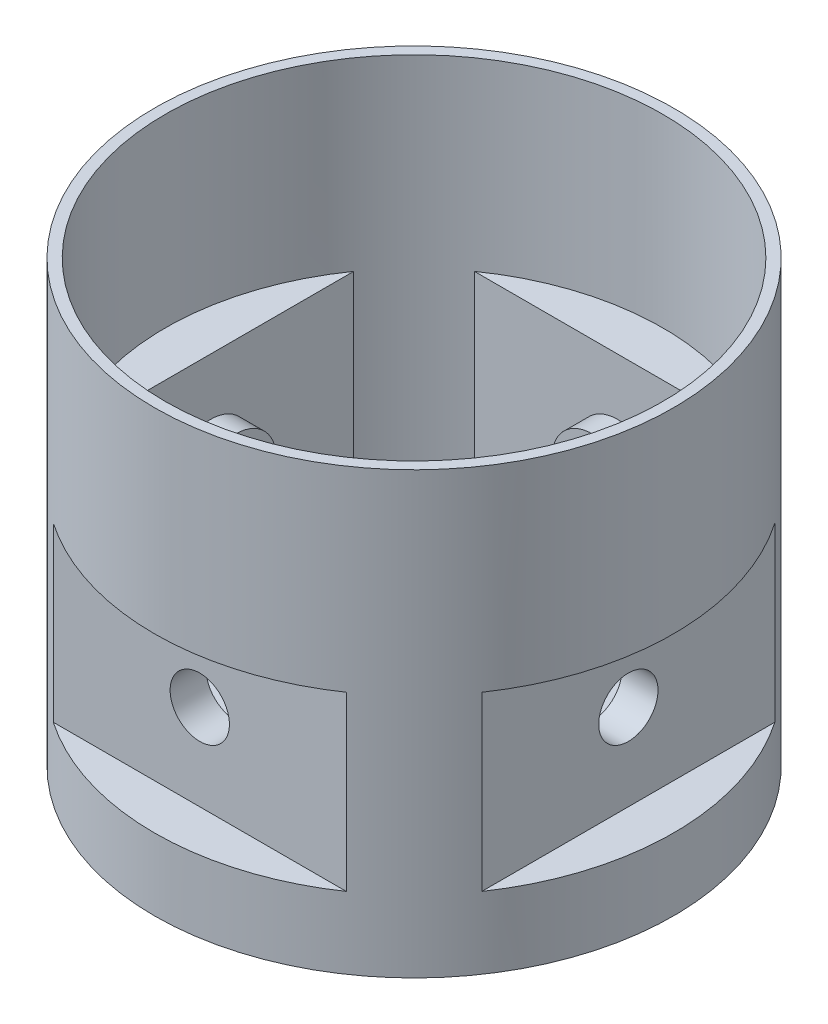
ISO-10303-21;
HEADER;
FILE_DESCRIPTION(('STEP AP214'),'2;1');
FILE_NAME('part.step','',(''),(''),'','','');
FILE_SCHEMA(('AUTOMOTIVE_DESIGN { 1 0 10303 214 1 1 1 1 }'));
ENDSEC;
DATA;
#1=APPLICATION_CONTEXT('core data for automotive mechanical design processes');
#2=APPLICATION_PROTOCOL_DEFINITION('international standard','automotive_design',2000,#1);
#3=PRODUCT_CONTEXT('',#1,'mechanical');
#4=PRODUCT('Part','Part','',(#3));
#5=PRODUCT_RELATED_PRODUCT_CATEGORY('part','',(#4));
#6=PRODUCT_DEFINITION_FORMATION('','',#4);
#7=PRODUCT_DEFINITION_CONTEXT('part definition',#1,'design');
#8=PRODUCT_DEFINITION('design','',#6,#7);
#9=PRODUCT_DEFINITION_SHAPE('','',#8);
#10=(LENGTH_UNIT() NAMED_UNIT(*) SI_UNIT(.MILLI.,.METRE.));
#11=(NAMED_UNIT(*) PLANE_ANGLE_UNIT() SI_UNIT($,.RADIAN.));
#12=(NAMED_UNIT(*) SI_UNIT($,.STERADIAN.) SOLID_ANGLE_UNIT());
#13=UNCERTAINTY_MEASURE_WITH_UNIT(LENGTH_MEASURE(1.E-05),#10,'distance_accuracy_value','');
#14=(GEOMETRIC_REPRESENTATION_CONTEXT(3) GLOBAL_UNCERTAINTY_ASSIGNED_CONTEXT((#13)) GLOBAL_UNIT_ASSIGNED_CONTEXT((#10,
#11,#12)) REPRESENTATION_CONTEXT('',''));
#15=CARTESIAN_POINT('',(0.,0.,0.));
#16=DIRECTION('',(0.,0.,1.));
#17=DIRECTION('',(1.,0.,0.));
#18=AXIS2_PLACEMENT_3D('',#15,#16,#17);
#19=CARTESIAN_POINT('',(-49.6427116670008,24.,0.));
#20=DIRECTION('',(-1.,0.,0.));
#21=DIRECTION('',(0.,0.,1.));
#22=AXIS2_PLACEMENT_3D('',#19,#20,#21);
#23=CYLINDRICAL_SURFACE('',#22,11.25);
#24=CARTESIAN_POINT('',(-56.6427116670008,24.,0.));
#25=DIRECTION('',(1.,0.,0.));
#26=DIRECTION('',(0.,0.,-1.));
#27=AXIS2_PLACEMENT_3D('',#24,#25,#26);
#28=CIRCLE('',#27,11.25);
#29=CARTESIAN_POINT('',(-56.6427116670008,24.,-11.25));
#30=VERTEX_POINT('',#29);
#31=EDGE_CURVE('E288',#30,#30,#28,.F.);
#32=ORIENTED_EDGE('',*,*,#31,.F.);
#33=EDGE_LOOP('',(#32));
#34=FACE_BOUND('',#33,.T.);
#35=CARTESIAN_POINT('',(-49.6427116670007,24.,0.));
#36=DIRECTION('',(1.,0.,0.));
#37=DIRECTION('',(0.,0.,-1.));
#38=AXIS2_PLACEMENT_3D('',#35,#36,#37);
#39=CIRCLE('',#38,11.25);
#40=CARTESIAN_POINT('',(-49.6427116670007,24.,-11.25));
#41=VERTEX_POINT('',#40);
#42=EDGE_CURVE('E44',#41,#41,#39,.F.);
#43=ORIENTED_EDGE('',*,*,#42,.T.);
#44=EDGE_LOOP('',(#43));
#45=FACE_BOUND('',#44,.T.);
#46=ADVANCED_FACE('F36',(#34,#45),#23,.T.);
#47=CARTESIAN_POINT('',(-5.21556825526507E-13,24.,49.6427116670008));
#48=DIRECTION('',(0.,0.,1.));
#49=DIRECTION('',(1.,0.,0.));
#50=AXIS2_PLACEMENT_3D('',#47,#48,#49);
#51=CYLINDRICAL_SURFACE('',#50,11.25);
#52=CARTESIAN_POINT('',(-5.92670103763697E-13,24.,56.6427116670008));
#53=DIRECTION('',(0.,0.,-1.));
#54=DIRECTION('',(-1.,0.,0.));
#55=AXIS2_PLACEMENT_3D('',#52,#53,#54);
#56=CIRCLE('',#55,11.25);
#57=CARTESIAN_POINT('',(-11.2500000000006,24.,56.6427116670006));
#58=VERTEX_POINT('',#57);
#59=EDGE_CURVE('E309',#58,#58,#56,.F.);
#60=ORIENTED_EDGE('',*,*,#59,.F.);
#61=EDGE_LOOP('',(#60));
#62=FACE_BOUND('',#61,.T.);
#63=CARTESIAN_POINT('',(-5.21556825526506E-13,24.,49.6427116670007));
#64=DIRECTION('',(0.,0.,-1.));
#65=DIRECTION('',(-1.,0.,0.));
#66=AXIS2_PLACEMENT_3D('',#63,#64,#65);
#67=CIRCLE('',#66,11.25);
#68=CARTESIAN_POINT('',(-11.2500000000005,24.,49.6427116670007));
#69=VERTEX_POINT('',#68);
#70=EDGE_CURVE('E190',#69,#69,#67,.F.);
#71=ORIENTED_EDGE('',*,*,#70,.T.);
#72=EDGE_LOOP('',(#71));
#73=FACE_BOUND('',#72,.T.);
#74=ADVANCED_FACE('F406',(#62,#73),#51,.T.);
#75=CARTESIAN_POINT('',(-59.6427116670008,48.,0.));
#76=DIRECTION('',(1.,0.,0.));
#77=DIRECTION('',(0.,0.,-1.));
#78=AXIS2_PLACEMENT_3D('',#75,#76,#77);
#79=PLANE('',#78);
#80=CARTESIAN_POINT('',(-59.6427116670008,24.,0.));
#81=DIRECTION('',(-1.,0.,0.));
#82=DIRECTION('',(0.,0.,1.));
#83=AXIS2_PLACEMENT_3D('',#80,#81,#82);
#84=CIRCLE('',#83,8.25);
#85=CARTESIAN_POINT('',(-59.6427116670008,24.,8.25));
#86=VERTEX_POINT('',#85);
#87=EDGE_CURVE('E225',#86,#86,#84,.T.);
#88=ORIENTED_EDGE('',*,*,#87,.F.);
#89=EDGE_LOOP('',(#88));
#90=FACE_BOUND('',#89,.T.);
#91=DIRECTION('',(0.,-1.,0.));
#92=VECTOR('',#91,1.);
#93=CARTESIAN_POINT('',(-59.6427116670008,48.,-40.7775605573336));
#94=LINE('',#93,#92);
#95=CARTESIAN_POINT('',(-59.6427116670008,48.,-40.7775605573336));
#96=VERTEX_POINT('',#95);
#97=CARTESIAN_POINT('',(-59.6427116670008,0.,-40.7775605573336));
#98=VERTEX_POINT('',#97);
#99=EDGE_CURVE('E187',#96,#98,#94,.T.);
#100=ORIENTED_EDGE('',*,*,#99,.T.);
#101=DIRECTION('',(0.,0.,1.));
#102=VECTOR('',#101,1.);
#103=CARTESIAN_POINT('',(-59.6427116670008,0.,0.));
#104=LINE('',#103,#102);
#105=CARTESIAN_POINT('',(-59.6427116670007,0.,40.7775605573336));
#106=VERTEX_POINT('',#105);
#107=EDGE_CURVE('E169',#98,#106,#104,.T.);
#108=ORIENTED_EDGE('',*,*,#107,.T.);
#109=DIRECTION('',(0.,-1.,0.));
#110=VECTOR('',#109,1.);
#111=CARTESIAN_POINT('',(-59.6427116670008,48.,40.7775605573336));
#112=LINE('',#111,#110);
#113=CARTESIAN_POINT('',(-59.6427116670008,48.,40.7775605573336));
#114=VERTEX_POINT('',#113);
#115=EDGE_CURVE('E179',#114,#106,#112,.T.);
#116=ORIENTED_EDGE('',*,*,#115,.F.);
#117=DIRECTION('',(0.,0.,1.));
#118=VECTOR('',#117,1.);
#119=CARTESIAN_POINT('',(-59.6427116670008,48.,0.));
#120=LINE('',#119,#118);
#121=EDGE_CURVE('E228',#96,#114,#120,.T.);
#122=ORIENTED_EDGE('',*,*,#121,.F.);
#123=EDGE_LOOP('',(#100,#108,#116,#122));
#124=FACE_BOUND('',#123,.T.);
#125=ADVANCED_FACE('F38',(#90,#124),#79,.F.);
#126=CARTESIAN_POINT('',(-6.20781672597972E-13,48.,59.6427116670008));
#127=DIRECTION('',(0.,0.,-1.));
#128=DIRECTION('',(-1.,0.,0.));
#129=AXIS2_PLACEMENT_3D('',#126,#127,#128);
#130=PLANE('',#129);
#131=CARTESIAN_POINT('',(-6.23147223008207E-13,24.,59.6427116670008));
#132=DIRECTION('',(0.,0.,1.));
#133=DIRECTION('',(1.,0.,0.));
#134=AXIS2_PLACEMENT_3D('',#131,#132,#133);
#135=CIRCLE('',#134,8.25);
#136=CARTESIAN_POINT('',(8.24999999999938,24.,59.6427116670008));
#137=VERTEX_POINT('',#136);
#138=EDGE_CURVE('E223',#137,#137,#135,.T.);
#139=ORIENTED_EDGE('',*,*,#138,.F.);
#140=EDGE_LOOP('',(#139));
#141=FACE_BOUND('',#140,.T.);
#142=DIRECTION('',(0.,-1.,0.));
#143=VECTOR('',#142,1.);
#144=CARTESIAN_POINT('',(-40.7775605573342,48.,59.6427116670003));
#145=LINE('',#144,#143);
#146=CARTESIAN_POINT('',(-40.7775605573342,48.,59.6427116670003));
#147=VERTEX_POINT('',#146);
#148=CARTESIAN_POINT('',(-40.7775605573342,0.,59.6427116670003));
#149=VERTEX_POINT('',#148);
#150=EDGE_CURVE('E168',#147,#149,#145,.T.);
#151=ORIENTED_EDGE('',*,*,#150,.T.);
#152=DIRECTION('',(1.,0.,0.));
#153=VECTOR('',#152,1.);
#154=CARTESIAN_POINT('',(-6.20781672597972E-13,0.,59.6427116670008));
#155=LINE('',#154,#153);
#156=CARTESIAN_POINT('',(40.777560557333,0.,59.6427116670012));
#157=VERTEX_POINT('',#156);
#158=EDGE_CURVE('E155',#149,#157,#155,.T.);
#159=ORIENTED_EDGE('',*,*,#158,.T.);
#160=DIRECTION('',(0.,-1.,0.));
#161=VECTOR('',#160,1.);
#162=CARTESIAN_POINT('',(40.777560557333,48.,59.6427116670012));
#163=LINE('',#162,#161);
#164=CARTESIAN_POINT('',(40.777560557333,48.,59.6427116670012));
#165=VERTEX_POINT('',#164);
#166=EDGE_CURVE('E166',#165,#157,#163,.T.);
#167=ORIENTED_EDGE('',*,*,#166,.F.);
#168=DIRECTION('',(1.,0.,0.));
#169=VECTOR('',#168,1.);
#170=CARTESIAN_POINT('',(-6.20781672597972E-13,48.,59.6427116670008));
#171=LINE('',#170,#169);
#172=EDGE_CURVE('E232',#147,#165,#171,.T.);
#173=ORIENTED_EDGE('',*,*,#172,.F.);
#174=EDGE_LOOP('',(#151,#159,#167,#173));
#175=FACE_BOUND('',#174,.T.);
#176=ADVANCED_FACE('F164',(#141,#175),#130,.F.);
#177=CARTESIAN_POINT('',(59.6427116670012,48.,0.));
#178=DIRECTION('',(-1.,0.,0.));
#179=DIRECTION('',(0.,0.,1.));
#180=AXIS2_PLACEMENT_3D('',#177,#178,#179);
#181=PLANE('',#180);
#182=CARTESIAN_POINT('',(59.6427116670008,24.,0.));
#183=DIRECTION('',(1.,0.,0.));
#184=DIRECTION('',(0.,0.,-1.));
#185=AXIS2_PLACEMENT_3D('',#182,#183,#184);
#186=CIRCLE('',#185,8.25);
#187=CARTESIAN_POINT('',(59.6427116670008,24.,-8.25));
#188=VERTEX_POINT('',#187);
#189=EDGE_CURVE('E846',#188,#188,#186,.T.);
#190=ORIENTED_EDGE('',*,*,#189,.F.);
#191=EDGE_LOOP('',(#190));
#192=FACE_BOUND('',#191,.T.);
#193=DIRECTION('',(0.,-1.,0.));
#194=VECTOR('',#193,1.);
#195=CARTESIAN_POINT('',(59.6427116670005,48.,40.777560557334));
#196=LINE('',#195,#194);
#197=CARTESIAN_POINT('',(59.6427116670005,48.,40.777560557334));
#198=VERTEX_POINT('',#197);
#199=CARTESIAN_POINT('',(59.6427116670005,0.,40.777560557334));
#200=VERTEX_POINT('',#199);
#201=EDGE_CURVE('E177',#198,#200,#196,.T.);
#202=ORIENTED_EDGE('',*,*,#201,.T.);
#203=DIRECTION('',(0.,0.,-1.));
#204=VECTOR('',#203,1.);
#205=CARTESIAN_POINT('',(59.6427116670012,0.,0.));
#206=LINE('',#205,#204);
#207=CARTESIAN_POINT('',(59.642711667001,0.,-40.7775605573333));
#208=VERTEX_POINT('',#207);
#209=EDGE_CURVE('E170',#200,#208,#206,.T.);
#210=ORIENTED_EDGE('',*,*,#209,.T.);
#211=DIRECTION('',(0.,-1.,0.));
#212=VECTOR('',#211,1.);
#213=CARTESIAN_POINT('',(59.6427116670012,48.,-40.7775605573335));
#214=LINE('',#213,#212);
#215=CARTESIAN_POINT('',(59.6427116670012,48.,-40.7775605573335));
#216=VERTEX_POINT('',#215);
#217=EDGE_CURVE('E59',#216,#208,#214,.T.);
#218=ORIENTED_EDGE('',*,*,#217,.F.);
#219=DIRECTION('',(0.,0.,-1.));
#220=VECTOR('',#219,1.);
#221=CARTESIAN_POINT('',(59.6427116670012,48.,0.));
#222=LINE('',#221,#220);
#223=EDGE_CURVE('E234',#198,#216,#222,.T.);
#224=ORIENTED_EDGE('',*,*,#223,.F.);
#225=EDGE_LOOP('',(#202,#210,#218,#224));
#226=FACE_BOUND('',#225,.T.);
#227=ADVANCED_FACE('F345',(#192,#226),#181,.F.);
#228=CARTESIAN_POINT('',(0.,48.,0.));
#229=DIRECTION('',(0.,-1.,0.));
#230=DIRECTION('',(0.,0.,-1.));
#231=AXIS2_PLACEMENT_3D('',#228,#229,#230);
#232=CYLINDRICAL_SURFACE('',#231,72.2500000000001);
#233=CARTESIAN_POINT('',(0.,0.,0.));
#234=DIRECTION('',(0.,1.,0.));
#235=DIRECTION('',(0.,0.,1.));
#236=AXIS2_PLACEMENT_3D('',#233,#234,#235);
#237=CIRCLE('',#236,72.25);
#238=EDGE_CURVE('E159',#98,#106,#237,.T.);
#239=ORIENTED_EDGE('',*,*,#238,.F.);
#240=ORIENTED_EDGE('',*,*,#99,.F.);
#241=CARTESIAN_POINT('',(0.,48.,0.));
#242=DIRECTION('',(0.,1.,0.));
#243=DIRECTION('',(0.,0.,1.));
#244=AXIS2_PLACEMENT_3D('',#241,#242,#243);
#245=CIRCLE('',#244,72.25);
#246=EDGE_CURVE('E252',#96,#114,#245,.T.);
#247=ORIENTED_EDGE('',*,*,#246,.T.);
#248=ORIENTED_EDGE('',*,*,#115,.T.);
#249=EDGE_LOOP('',(#239,#240,#247,#248));
#250=FACE_BOUND('',#249,.T.);
#251=EDGE_CURVE('E152',#149,#157,#237,.T.);
#252=ORIENTED_EDGE('',*,*,#251,.F.);
#253=ORIENTED_EDGE('',*,*,#150,.F.);
#254=EDGE_CURVE('E176',#147,#165,#245,.T.);
#255=ORIENTED_EDGE('',*,*,#254,.T.);
#256=ORIENTED_EDGE('',*,*,#166,.T.);
#257=EDGE_LOOP('',(#252,#253,#255,#256));
#258=FACE_BOUND('',#257,.T.);
#259=EDGE_CURVE('E162',#200,#208,#237,.T.);
#260=ORIENTED_EDGE('',*,*,#259,.F.);
#261=ORIENTED_EDGE('',*,*,#201,.F.);
#262=EDGE_CURVE('E245',#198,#216,#245,.T.);
#263=ORIENTED_EDGE('',*,*,#262,.T.);
#264=ORIENTED_EDGE('',*,*,#217,.T.);
#265=EDGE_LOOP('',(#260,#261,#263,#264));
#266=FACE_BOUND('',#265,.T.);
#267=CARTESIAN_POINT('',(40.7775605573338,0.,-59.6427116670006));
#268=VERTEX_POINT('',#267);
#269=CARTESIAN_POINT('',(-40.7775605573334,0.,-59.6427116670009));
#270=VERTEX_POINT('',#269);
#271=EDGE_CURVE('E354',#268,#270,#237,.T.);
#272=ORIENTED_EDGE('',*,*,#271,.F.);
#273=DIRECTION('',(0.,-1.,0.));
#274=VECTOR('',#273,1.);
#275=CARTESIAN_POINT('',(40.7775605573338,48.,-59.6427116670006));
#276=LINE('',#275,#274);
#277=CARTESIAN_POINT('',(40.7775605573338,48.,-59.6427116670006));
#278=VERTEX_POINT('',#277);
#279=EDGE_CURVE('E51',#278,#268,#276,.T.);
#280=ORIENTED_EDGE('',*,*,#279,.F.);
#281=CARTESIAN_POINT('',(-40.7775605573334,48.,-59.6427116670009));
#282=VERTEX_POINT('',#281);
#283=EDGE_CURVE('E248',#278,#282,#245,.T.);
#284=ORIENTED_EDGE('',*,*,#283,.T.);
#285=DIRECTION('',(0.,-1.,0.));
#286=VECTOR('',#285,1.);
#287=CARTESIAN_POINT('',(-40.7775605573334,48.,-59.6427116670009));
#288=LINE('',#287,#286);
#289=EDGE_CURVE('E239',#282,#270,#288,.T.);
#290=ORIENTED_EDGE('',*,*,#289,.T.);
#291=EDGE_LOOP('',(#272,#280,#284,#290));
#292=FACE_BOUND('',#291,.T.);
#293=CARTESIAN_POINT('',(0.,102.5,0.));
#294=DIRECTION('',(0.,1.,0.));
#295=DIRECTION('',(0.,0.,1.));
#296=AXIS2_PLACEMENT_3D('',#293,#294,#295);
#297=CIRCLE('',#296,72.25);
#298=CARTESIAN_POINT('',(0.,102.5,72.25));
#299=VERTEX_POINT('',#298);
#300=EDGE_CURVE('E247',#299,#299,#297,.T.);
#301=ORIENTED_EDGE('',*,*,#300,.F.);
#302=EDGE_LOOP('',(#301));
#303=FACE_BOUND('',#302,.T.);
#304=CARTESIAN_POINT('',(0.,-20.,0.));
#305=DIRECTION('',(0.,1.,0.));
#306=DIRECTION('',(0.,0.,1.));
#307=AXIS2_PLACEMENT_3D('',#304,#305,#306);
#308=CIRCLE('',#307,72.25);
#309=CARTESIAN_POINT('',(0.,-20.,72.25));
#310=VERTEX_POINT('',#309);
#311=EDGE_CURVE('E350',#310,#310,#308,.T.);
#312=ORIENTED_EDGE('',*,*,#311,.T.);
#313=EDGE_LOOP('',(#312));
#314=FACE_BOUND('',#313,.T.);
#315=ADVANCED_FACE('F173',(#250,#258,#266,#292,#303,#314),#232,.T.);
#316=CARTESIAN_POINT('',(2.13130537913176E-13,48.,-59.6427116670008));
#317=DIRECTION('',(0.,0.,1.));
#318=DIRECTION('',(1.,0.,0.));
#319=AXIS2_PLACEMENT_3D('',#316,#317,#318);
#320=PLANE('',#319);
#321=CARTESIAN_POINT('',(2.06664393441538E-13,24.,-59.6427116670008));
#322=DIRECTION('',(0.,0.,-1.));
#323=DIRECTION('',(-1.,0.,0.));
#324=AXIS2_PLACEMENT_3D('',#321,#322,#323);
#325=CIRCLE('',#324,8.25);
#326=CARTESIAN_POINT('',(-8.24999999999979,24.,-59.6427116670008));
#327=VERTEX_POINT('',#326);
#328=EDGE_CURVE('E229',#327,#327,#325,.T.);
#329=ORIENTED_EDGE('',*,*,#328,.F.);
#330=EDGE_LOOP('',(#329));
#331=FACE_BOUND('',#330,.T.);
#332=ORIENTED_EDGE('',*,*,#279,.T.);
#333=DIRECTION('',(-1.,0.,0.));
#334=VECTOR('',#333,1.);
#335=CARTESIAN_POINT('',(2.13130537913176E-13,0.,-59.6427116670008));
#336=LINE('',#335,#334);
#337=EDGE_CURVE('E11',#268,#270,#336,.T.);
#338=ORIENTED_EDGE('',*,*,#337,.T.);
#339=ORIENTED_EDGE('',*,*,#289,.F.);
#340=DIRECTION('',(-1.,0.,0.));
#341=VECTOR('',#340,1.);
#342=CARTESIAN_POINT('',(2.13130537913176E-13,48.,-59.6427116670008));
#343=LINE('',#342,#341);
#344=EDGE_CURVE('E236',#278,#282,#343,.T.);
#345=ORIENTED_EDGE('',*,*,#344,.F.);
#346=EDGE_LOOP('',(#332,#338,#339,#345));
#347=FACE_BOUND('',#346,.T.);
#348=ADVANCED_FACE('F344',(#331,#347),#320,.F.);
#349=CARTESIAN_POINT('',(-49.6427116670008,24.,0.));
#350=DIRECTION('',(-1.,0.,0.));
#351=DIRECTION('',(0.,0.,1.));
#352=AXIS2_PLACEMENT_3D('',#349,#350,#351);
#353=CYLINDRICAL_SURFACE('',#352,8.25);
#354=CARTESIAN_POINT('',(-49.6427116670008,24.,0.));
#355=DIRECTION('',(-1.,0.,0.));
#356=DIRECTION('',(0.,0.,1.));
#357=AXIS2_PLACEMENT_3D('',#354,#355,#356);
#358=CIRCLE('',#357,8.25);
#359=CARTESIAN_POINT('',(-49.6427116670008,24.,8.25));
#360=VERTEX_POINT('',#359);
#361=EDGE_CURVE('E210',#360,#360,#358,.T.);
#362=ORIENTED_EDGE('',*,*,#361,.F.);
#363=EDGE_LOOP('',(#362));
#364=FACE_BOUND('',#363,.T.);
#365=ORIENTED_EDGE('',*,*,#87,.T.);
#366=EDGE_LOOP('',(#365));
#367=FACE_BOUND('',#366,.T.);
#368=ADVANCED_FACE('F545',(#364,#367),#353,.F.);
#369=CARTESIAN_POINT('',(1.74903622736701E-13,24.,-49.6427116670008));
#370=DIRECTION('',(0.,0.,-1.));
#371=DIRECTION('',(-1.,0.,0.));
#372=AXIS2_PLACEMENT_3D('',#369,#370,#371);
#373=CYLINDRICAL_SURFACE('',#372,8.25);
#374=CARTESIAN_POINT('',(1.74903622736701E-13,24.,-49.6427116670008));
#375=DIRECTION('',(0.,0.,-1.));
#376=DIRECTION('',(-1.,0.,0.));
#377=AXIS2_PLACEMENT_3D('',#374,#375,#376);
#378=CIRCLE('',#377,8.25);
#379=CARTESIAN_POINT('',(-8.24999999999983,24.,-49.6427116670008));
#380=VERTEX_POINT('',#379);
#381=EDGE_CURVE('E213',#380,#380,#378,.T.);
#382=ORIENTED_EDGE('',*,*,#381,.F.);
#383=EDGE_LOOP('',(#382));
#384=FACE_BOUND('',#383,.T.);
#385=ORIENTED_EDGE('',*,*,#328,.T.);
#386=EDGE_LOOP('',(#385));
#387=FACE_BOUND('',#386,.T.);
#388=ADVANCED_FACE('F810',(#384,#387),#373,.F.);
#389=CARTESIAN_POINT('',(49.6427116670008,24.,0.));
#390=DIRECTION('',(1.,0.,0.));
#391=DIRECTION('',(0.,0.,-1.));
#392=AXIS2_PLACEMENT_3D('',#389,#390,#391);
#393=CYLINDRICAL_SURFACE('',#392,8.25);
#394=CARTESIAN_POINT('',(49.6427116670008,24.,0.));
#395=DIRECTION('',(1.,0.,0.));
#396=DIRECTION('',(0.,0.,-1.));
#397=AXIS2_PLACEMENT_3D('',#394,#395,#396);
#398=CIRCLE('',#397,8.25);
#399=CARTESIAN_POINT('',(49.6427116670008,24.,-8.25));
#400=VERTEX_POINT('',#399);
#401=EDGE_CURVE('E219',#400,#400,#398,.T.);
#402=ORIENTED_EDGE('',*,*,#401,.F.);
#403=EDGE_LOOP('',(#402));
#404=FACE_BOUND('',#403,.T.);
#405=ORIENTED_EDGE('',*,*,#189,.T.);
#406=EDGE_LOOP('',(#405));
#407=FACE_BOUND('',#406,.T.);
#408=ADVANCED_FACE('F801',(#404,#407),#393,.F.);
#409=CARTESIAN_POINT('',(-5.21556825526507E-13,24.,49.6427116670008));
#410=DIRECTION('',(0.,0.,1.));
#411=DIRECTION('',(1.,0.,0.));
#412=AXIS2_PLACEMENT_3D('',#409,#410,#411);
#413=CYLINDRICAL_SURFACE('',#412,8.25);
#414=CARTESIAN_POINT('',(-5.21556825526507E-13,24.,49.6427116670008));
#415=DIRECTION('',(0.,0.,1.));
#416=DIRECTION('',(1.,0.,0.));
#417=AXIS2_PLACEMENT_3D('',#414,#415,#416);
#418=CIRCLE('',#417,8.25);
#419=CARTESIAN_POINT('',(8.24999999999948,24.,49.6427116670008));
#420=VERTEX_POINT('',#419);
#421=EDGE_CURVE('E360',#420,#420,#418,.T.);
#422=ORIENTED_EDGE('',*,*,#421,.F.);
#423=EDGE_LOOP('',(#422));
#424=FACE_BOUND('',#423,.T.);
#425=ORIENTED_EDGE('',*,*,#138,.T.);
#426=EDGE_LOOP('',(#425));
#427=FACE_BOUND('',#426,.T.);
#428=ADVANCED_FACE('F778',(#424,#427),#413,.F.);
#429=CARTESIAN_POINT('',(0.,48.,0.));
#430=DIRECTION('',(0.,1.,0.));
#431=DIRECTION('',(0.,0.,1.));
#432=AXIS2_PLACEMENT_3D('',#429,#430,#431);
#433=PLANE('',#432);
#434=ORIENTED_EDGE('',*,*,#246,.F.);
#435=ORIENTED_EDGE('',*,*,#121,.T.);
#436=EDGE_LOOP('',(#434,#435));
#437=FACE_BOUND('',#436,.T.);
#438=ADVANCED_FACE('F758',(#437),#433,.F.);
#439=ORIENTED_EDGE('',*,*,#254,.F.);
#440=ORIENTED_EDGE('',*,*,#172,.T.);
#441=EDGE_LOOP('',(#439,#440));
#442=FACE_BOUND('',#441,.T.);
#443=ADVANCED_FACE('F765',(#442),#433,.F.);
#444=ORIENTED_EDGE('',*,*,#262,.F.);
#445=ORIENTED_EDGE('',*,*,#223,.T.);
#446=EDGE_LOOP('',(#444,#445));
#447=FACE_BOUND('',#446,.T.);
#448=ADVANCED_FACE('F755',(#447),#433,.F.);
#449=ORIENTED_EDGE('',*,*,#283,.F.);
#450=ORIENTED_EDGE('',*,*,#344,.T.);
#451=EDGE_LOOP('',(#449,#450));
#452=FACE_BOUND('',#451,.T.);
#453=ADVANCED_FACE('F338',(#452),#433,.F.);
#454=CARTESIAN_POINT('',(0.,102.5,0.));
#455=DIRECTION('',(0.,1.,0.));
#456=DIRECTION('',(0.,0.,1.));
#457=AXIS2_PLACEMENT_3D('',#454,#455,#456);
#458=PLANE('',#457);
#459=CARTESIAN_POINT('',(0.,102.5,0.));
#460=DIRECTION('',(0.,1.,0.));
#461=DIRECTION('',(0.,0.,1.));
#462=AXIS2_PLACEMENT_3D('',#459,#460,#461);
#463=CIRCLE('',#462,69.2500000000001);
#464=CARTESIAN_POINT('',(0.,102.5,69.2500000000001));
#465=VERTEX_POINT('',#464);
#466=EDGE_CURVE('E306',#465,#465,#463,.T.);
#467=ORIENTED_EDGE('',*,*,#466,.F.);
#468=EDGE_LOOP('',(#467));
#469=FACE_BOUND('',#468,.T.);
#470=ORIENTED_EDGE('',*,*,#300,.T.);
#471=EDGE_LOOP('',(#470));
#472=FACE_BOUND('',#471,.T.);
#473=ADVANCED_FACE('F334',(#469,#472),#458,.T.);
#474=CARTESIAN_POINT('',(-56.6427116670008,48.,0.));
#475=DIRECTION('',(1.,0.,0.));
#476=DIRECTION('',(0.,0.,-1.));
#477=AXIS2_PLACEMENT_3D('',#474,#475,#476);
#478=PLANE('',#477);
#479=ORIENTED_EDGE('',*,*,#31,.T.);
#480=EDGE_LOOP('',(#479));
#481=FACE_BOUND('',#480,.T.);
#482=DIRECTION('',(0.,0.,1.));
#483=VECTOR('',#482,1.);
#484=CARTESIAN_POINT('',(-56.6427116670008,0.,0.));
#485=LINE('',#484,#483);
#486=CARTESIAN_POINT('',(-56.6427116670008,0.,-39.839248424249));
#487=VERTEX_POINT('',#486);
#488=CARTESIAN_POINT('',(-56.6427116670007,0.,39.8392484242491));
#489=VERTEX_POINT('',#488);
#490=EDGE_CURVE('E287',#487,#489,#485,.T.);
#491=ORIENTED_EDGE('',*,*,#490,.F.);
#492=DIRECTION('',(0.,-1.,0.));
#493=VECTOR('',#492,1.);
#494=CARTESIAN_POINT('',(-56.6427116670008,51.,-39.839248424249));
#495=LINE('',#494,#493);
#496=CARTESIAN_POINT('',(-56.6427116670008,51.,-39.839248424249));
#497=VERTEX_POINT('',#496);
#498=EDGE_CURVE('E253',#497,#487,#495,.T.);
#499=ORIENTED_EDGE('',*,*,#498,.F.);
#500=DIRECTION('',(0.,0.,1.));
#501=VECTOR('',#500,1.);
#502=CARTESIAN_POINT('',(-56.6427116670008,51.,0.));
#503=LINE('',#502,#501);
#504=CARTESIAN_POINT('',(-56.6427116670007,51.,39.8392484242491));
#505=VERTEX_POINT('',#504);
#506=EDGE_CURVE('E268',#497,#505,#503,.T.);
#507=ORIENTED_EDGE('',*,*,#506,.T.);
#508=DIRECTION('',(0.,-1.,0.));
#509=VECTOR('',#508,1.);
#510=CARTESIAN_POINT('',(-56.6427116670007,51.,39.8392484242491));
#511=LINE('',#510,#509);
#512=EDGE_CURVE('E256',#505,#489,#511,.T.);
#513=ORIENTED_EDGE('',*,*,#512,.T.);
#514=EDGE_LOOP('',(#491,#499,#507,#513));
#515=FACE_BOUND('',#514,.T.);
#516=ADVANCED_FACE('F337',(#481,#515),#478,.T.);
#517=CARTESIAN_POINT('',(-5.8955665003039E-13,48.,56.6427116670008));
#518=DIRECTION('',(0.,0.,-1.));
#519=DIRECTION('',(-1.,0.,0.));
#520=AXIS2_PLACEMENT_3D('',#517,#518,#519);
#521=PLANE('',#520);
#522=ORIENTED_EDGE('',*,*,#59,.T.);
#523=EDGE_LOOP('',(#522));
#524=FACE_BOUND('',#523,.T.);
#525=DIRECTION('',(1.,0.,0.));
#526=VECTOR('',#525,1.);
#527=CARTESIAN_POINT('',(-5.8955665003039E-13,0.,56.6427116670008));
#528=LINE('',#527,#526);
#529=CARTESIAN_POINT('',(-39.8392484242497,0.,56.6427116670003));
#530=VERTEX_POINT('',#529);
#531=CARTESIAN_POINT('',(39.8392484242485,0.,56.6427116670012));
#532=VERTEX_POINT('',#531);
#533=EDGE_CURVE('E293',#530,#532,#528,.T.);
#534=ORIENTED_EDGE('',*,*,#533,.F.);
#535=DIRECTION('',(0.,-1.,0.));
#536=VECTOR('',#535,1.);
#537=CARTESIAN_POINT('',(-39.8392484242497,51.,56.6427116670003));
#538=LINE('',#537,#536);
#539=CARTESIAN_POINT('',(-39.8392484242497,51.,56.6427116670003));
#540=VERTEX_POINT('',#539);
#541=EDGE_CURVE('E264',#540,#530,#538,.T.);
#542=ORIENTED_EDGE('',*,*,#541,.F.);
#543=DIRECTION('',(1.,0.,0.));
#544=VECTOR('',#543,1.);
#545=CARTESIAN_POINT('',(-5.8955665003039E-13,51.,56.6427116670008));
#546=LINE('',#545,#544);
#547=CARTESIAN_POINT('',(39.8392484242485,51.,56.6427116670012));
#548=VERTEX_POINT('',#547);
#549=EDGE_CURVE('E314',#540,#548,#546,.T.);
#550=ORIENTED_EDGE('',*,*,#549,.T.);
#551=DIRECTION('',(0.,-1.,0.));
#552=VECTOR('',#551,1.);
#553=CARTESIAN_POINT('',(39.8392484242485,51.,56.6427116670012));
#554=LINE('',#553,#552);
#555=EDGE_CURVE('E295',#548,#532,#554,.T.);
#556=ORIENTED_EDGE('',*,*,#555,.T.);
#557=EDGE_LOOP('',(#534,#542,#550,#556));
#558=FACE_BOUND('',#557,.T.);
#559=ADVANCED_FACE('F373',(#524,#558),#521,.T.);
#560=CARTESIAN_POINT('',(56.6427116670012,48.,0.));
#561=DIRECTION('',(-1.,0.,0.));
#562=DIRECTION('',(0.,0.,1.));
#563=AXIS2_PLACEMENT_3D('',#560,#561,#562);
#564=PLANE('',#563);
#565=CARTESIAN_POINT('',(56.6427116670012,24.,0.));
#566=DIRECTION('',(-1.,0.,0.));
#567=DIRECTION('',(0.,0.,1.));
#568=AXIS2_PLACEMENT_3D('',#565,#566,#567);
#569=CIRCLE('',#568,11.25);
#570=CARTESIAN_POINT('',(56.6427116670012,24.,11.25));
#571=VERTEX_POINT('',#570);
#572=EDGE_CURVE('E312',#571,#571,#569,.F.);
#573=ORIENTED_EDGE('',*,*,#572,.T.);
#574=EDGE_LOOP('',(#573));
#575=FACE_BOUND('',#574,.T.);
#576=DIRECTION('',(0.,0.,-1.));
#577=VECTOR('',#576,1.);
#578=CARTESIAN_POINT('',(56.6427116670012,0.,0.));
#579=LINE('',#578,#577);
#580=CARTESIAN_POINT('',(56.6427116670012,0.,39.8392484242485));
#581=VERTEX_POINT('',#580);
#582=CARTESIAN_POINT('',(56.6427116670011,0.,-39.8392484242485));
#583=VERTEX_POINT('',#582);
#584=EDGE_CURVE('E272',#581,#583,#579,.T.);
#585=ORIENTED_EDGE('',*,*,#584,.F.);
#586=DIRECTION('',(0.,-1.,0.));
#587=VECTOR('',#586,1.);
#588=CARTESIAN_POINT('',(56.6427116670012,51.,39.8392484242485));
#589=LINE('',#588,#587);
#590=CARTESIAN_POINT('',(56.6427116670012,51.,39.8392484242485));
#591=VERTEX_POINT('',#590);
#592=EDGE_CURVE('E299',#591,#581,#589,.T.);
#593=ORIENTED_EDGE('',*,*,#592,.F.);
#594=DIRECTION('',(0.,0.,-1.));
#595=VECTOR('',#594,1.);
#596=CARTESIAN_POINT('',(56.6427116670012,51.,0.));
#597=LINE('',#596,#595);
#598=CARTESIAN_POINT('',(56.6427116670011,51.,-39.8392484242485));
#599=VERTEX_POINT('',#598);
#600=EDGE_CURVE('E317',#591,#599,#597,.T.);
#601=ORIENTED_EDGE('',*,*,#600,.T.);
#602=DIRECTION('',(0.,-1.,0.));
#603=VECTOR('',#602,1.);
#604=CARTESIAN_POINT('',(56.6427116670011,51.,-39.8392484242485));
#605=LINE('',#604,#603);
#606=EDGE_CURVE('E276',#599,#583,#605,.T.);
#607=ORIENTED_EDGE('',*,*,#606,.T.);
#608=EDGE_LOOP('',(#585,#593,#601,#607));
#609=FACE_BOUND('',#608,.T.);
#610=ADVANCED_FACE('F379',(#575,#609),#564,.T.);
#611=CARTESIAN_POINT('',(0.,48.,0.));
#612=DIRECTION('',(0.,-1.,0.));
#613=DIRECTION('',(0.,0.,-1.));
#614=AXIS2_PLACEMENT_3D('',#611,#612,#613);
#615=CYLINDRICAL_SURFACE('',#614,69.2500000000001);
#616=CARTESIAN_POINT('',(0.,0.,0.));
#617=DIRECTION('',(0.,1.,0.));
#618=DIRECTION('',(0.,0.,1.));
#619=AXIS2_PLACEMENT_3D('',#616,#617,#618);
#620=CIRCLE('',#619,69.2500000000001);
#621=CARTESIAN_POINT('',(39.8392484242493,0.,-56.6427116670006));
#622=VERTEX_POINT('',#621);
#623=EDGE_CURVE('E269',#583,#622,#620,.T.);
#624=ORIENTED_EDGE('',*,*,#623,.F.);
#625=ORIENTED_EDGE('',*,*,#606,.F.);
#626=CARTESIAN_POINT('',(0.,51.,0.));
#627=DIRECTION('',(0.,1.,0.));
#628=DIRECTION('',(0.,0.,1.));
#629=AXIS2_PLACEMENT_3D('',#626,#627,#628);
#630=CIRCLE('',#629,69.2500000000001);
#631=EDGE_CURVE('E281',#591,#599,#630,.T.);
#632=ORIENTED_EDGE('',*,*,#631,.F.);
#633=ORIENTED_EDGE('',*,*,#592,.T.);
#634=CARTESIAN_POINT('',(0.,0.,0.));
#635=DIRECTION('',(0.,1.,0.));
#636=DIRECTION('',(0.,0.,1.));
#637=AXIS2_PLACEMENT_3D('',#634,#635,#636);
#638=CIRCLE('',#637,69.2500000000001);
#639=EDGE_CURVE('E300',#532,#581,#638,.T.);
#640=ORIENTED_EDGE('',*,*,#639,.F.);
#641=ORIENTED_EDGE('',*,*,#555,.F.);
#642=CARTESIAN_POINT('',(0.,51.,0.));
#643=DIRECTION('',(0.,1.,0.));
#644=DIRECTION('',(0.,0.,1.));
#645=AXIS2_PLACEMENT_3D('',#642,#643,#644);
#646=CIRCLE('',#645,69.2500000000001);
#647=EDGE_CURVE('E212',#540,#548,#646,.T.);
#648=ORIENTED_EDGE('',*,*,#647,.F.);
#649=ORIENTED_EDGE('',*,*,#541,.T.);
#650=CARTESIAN_POINT('',(0.,0.,0.));
#651=DIRECTION('',(0.,1.,0.));
#652=DIRECTION('',(0.,0.,1.));
#653=AXIS2_PLACEMENT_3D('',#650,#651,#652);
#654=CIRCLE('',#653,69.2500000000001);
#655=EDGE_CURVE('E291',#489,#530,#654,.T.);
#656=ORIENTED_EDGE('',*,*,#655,.F.);
#657=ORIENTED_EDGE('',*,*,#512,.F.);
#658=CARTESIAN_POINT('',(0.,51.,0.));
#659=DIRECTION('',(0.,1.,0.));
#660=DIRECTION('',(0.,0.,1.));
#661=AXIS2_PLACEMENT_3D('',#658,#659,#660);
#662=CIRCLE('',#661,69.2500000000001);
#663=EDGE_CURVE('E216',#497,#505,#662,.T.);
#664=ORIENTED_EDGE('',*,*,#663,.F.);
#665=ORIENTED_EDGE('',*,*,#498,.T.);
#666=CARTESIAN_POINT('',(0.,0.,0.));
#667=DIRECTION('',(0.,1.,0.));
#668=DIRECTION('',(0.,0.,1.));
#669=AXIS2_PLACEMENT_3D('',#666,#667,#668);
#670=CIRCLE('',#669,69.2500000000001);
#671=CARTESIAN_POINT('',(-39.8392484242489,0.,-56.6427116670009));
#672=VERTEX_POINT('',#671);
#673=EDGE_CURVE('E285',#672,#487,#670,.T.);
#674=ORIENTED_EDGE('',*,*,#673,.F.);
#675=DIRECTION('',(0.,-1.,0.));
#676=VECTOR('',#675,1.);
#677=CARTESIAN_POINT('',(-39.8392484242489,51.,-56.6427116670009));
#678=LINE('',#677,#676);
#679=CARTESIAN_POINT('',(-39.8392484242489,51.,-56.6427116670009));
#680=VERTEX_POINT('',#679);
#681=EDGE_CURVE('E277',#680,#672,#678,.T.);
#682=ORIENTED_EDGE('',*,*,#681,.F.);
#683=CARTESIAN_POINT('',(0.,51.,0.));
#684=DIRECTION('',(0.,1.,0.));
#685=DIRECTION('',(0.,0.,1.));
#686=AXIS2_PLACEMENT_3D('',#683,#684,#685);
#687=CIRCLE('',#686,69.2500000000001);
#688=CARTESIAN_POINT('',(39.8392484242493,51.,-56.6427116670006));
#689=VERTEX_POINT('',#688);
#690=EDGE_CURVE('E278',#689,#680,#687,.T.);
#691=ORIENTED_EDGE('',*,*,#690,.F.);
#692=DIRECTION('',(0.,-1.,0.));
#693=VECTOR('',#692,1.);
#694=CARTESIAN_POINT('',(39.8392484242493,51.,-56.6427116670006));
#695=LINE('',#694,#693);
#696=EDGE_CURVE('E273',#689,#622,#695,.T.);
#697=ORIENTED_EDGE('',*,*,#696,.T.);
#698=EDGE_LOOP('',(#624,#625,#632,#633,#640,#641,#648,#649,#656,#657,#664,#665,#674,#682,#691,#697));
#699=FACE_BOUND('',#698,.T.);
#700=ORIENTED_EDGE('',*,*,#466,.T.);
#701=EDGE_LOOP('',(#700));
#702=FACE_BOUND('',#701,.T.);
#703=ADVANCED_FACE('F332',(#699,#702),#615,.F.);
#704=CARTESIAN_POINT('',(2.02410173331005E-13,48.,-56.6427116670008));
#705=DIRECTION('',(0.,0.,1.));
#706=DIRECTION('',(1.,0.,0.));
#707=AXIS2_PLACEMENT_3D('',#704,#705,#706);
#708=PLANE('',#707);
#709=CARTESIAN_POINT('',(1.97136162230087E-13,24.,-56.6427116670008));
#710=DIRECTION('',(0.,0.,1.));
#711=DIRECTION('',(1.,0.,0.));
#712=AXIS2_PLACEMENT_3D('',#709,#710,#711);
#713=CIRCLE('',#712,11.25);
#714=CARTESIAN_POINT('',(11.2500000000002,24.,-56.6427116670007));
#715=VERTEX_POINT('',#714);
#716=EDGE_CURVE('E322',#715,#715,#713,.F.);
#717=ORIENTED_EDGE('',*,*,#716,.T.);
#718=EDGE_LOOP('',(#717));
#719=FACE_BOUND('',#718,.T.);
#720=DIRECTION('',(-1.,0.,0.));
#721=VECTOR('',#720,1.);
#722=CARTESIAN_POINT('',(2.02410173331005E-13,0.,-56.6427116670008));
#723=LINE('',#722,#721);
#724=EDGE_CURVE('E271',#622,#672,#723,.T.);
#725=ORIENTED_EDGE('',*,*,#724,.F.);
#726=ORIENTED_EDGE('',*,*,#696,.F.);
#727=DIRECTION('',(-1.,0.,0.));
#728=VECTOR('',#727,1.);
#729=CARTESIAN_POINT('',(2.02410173331005E-13,51.,-56.6427116670008));
#730=LINE('',#729,#728);
#731=EDGE_CURVE('E284',#689,#680,#730,.T.);
#732=ORIENTED_EDGE('',*,*,#731,.T.);
#733=ORIENTED_EDGE('',*,*,#681,.T.);
#734=EDGE_LOOP('',(#725,#726,#732,#733));
#735=FACE_BOUND('',#734,.T.);
#736=ADVANCED_FACE('F383',(#719,#735),#708,.T.);
#737=CARTESIAN_POINT('',(0.,0.,0.));
#738=DIRECTION('',(0.,1.,0.));
#739=DIRECTION('',(0.,0.,1.));
#740=AXIS2_PLACEMENT_3D('',#737,#738,#739);
#741=PLANE('',#740);
#742=ORIENTED_EDGE('',*,*,#673,.T.);
#743=ORIENTED_EDGE('',*,*,#490,.T.);
#744=ORIENTED_EDGE('',*,*,#655,.T.);
#745=ORIENTED_EDGE('',*,*,#533,.T.);
#746=ORIENTED_EDGE('',*,*,#639,.T.);
#747=ORIENTED_EDGE('',*,*,#584,.T.);
#748=ORIENTED_EDGE('',*,*,#623,.T.);
#749=ORIENTED_EDGE('',*,*,#724,.T.);
#750=EDGE_LOOP('',(#742,#743,#744,#745,#746,#747,#748,#749));
#751=FACE_BOUND('',#750,.T.);
#752=ADVANCED_FACE('F364',(#751),#741,.T.);
#753=CARTESIAN_POINT('',(1.74903622736701E-13,24.,-49.6427116670008));
#754=DIRECTION('',(0.,0.,-1.));
#755=DIRECTION('',(-1.,0.,0.));
#756=AXIS2_PLACEMENT_3D('',#753,#754,#755);
#757=CYLINDRICAL_SURFACE('',#756,11.25);
#758=CARTESIAN_POINT('',(1.749036227367E-13,24.,-49.6427116670007));
#759=DIRECTION('',(0.,0.,-1.));
#760=DIRECTION('',(-1.,0.,0.));
#761=AXIS2_PLACEMENT_3D('',#758,#759,#760);
#762=CIRCLE('',#761,11.25);
#763=CARTESIAN_POINT('',(-11.2499999999998,24.,-49.6427116670007));
#764=VERTEX_POINT('',#763);
#765=EDGE_CURVE('E196',#764,#764,#762,.F.);
#766=ORIENTED_EDGE('',*,*,#765,.F.);
#767=EDGE_LOOP('',(#766));
#768=FACE_BOUND('',#767,.T.);
#769=ORIENTED_EDGE('',*,*,#716,.F.);
#770=EDGE_LOOP('',(#769));
#771=FACE_BOUND('',#770,.T.);
#772=ADVANCED_FACE('F417',(#768,#771),#757,.T.);
#773=CARTESIAN_POINT('',(49.6427116670008,24.,0.));
#774=DIRECTION('',(1.,0.,0.));
#775=DIRECTION('',(0.,0.,-1.));
#776=AXIS2_PLACEMENT_3D('',#773,#774,#775);
#777=CYLINDRICAL_SURFACE('',#776,11.25);
#778=CARTESIAN_POINT('',(49.6427116670007,24.,0.));
#779=DIRECTION('',(1.,0.,0.));
#780=DIRECTION('',(0.,0.,-1.));
#781=AXIS2_PLACEMENT_3D('',#778,#779,#780);
#782=CIRCLE('',#781,11.25);
#783=CARTESIAN_POINT('',(49.6427116670007,24.,-11.25));
#784=VERTEX_POINT('',#783);
#785=EDGE_CURVE('E193',#784,#784,#782,.F.);
#786=ORIENTED_EDGE('',*,*,#785,.F.);
#787=EDGE_LOOP('',(#786));
#788=FACE_BOUND('',#787,.T.);
#789=ORIENTED_EDGE('',*,*,#572,.F.);
#790=EDGE_LOOP('',(#789));
#791=FACE_BOUND('',#790,.T.);
#792=ADVANCED_FACE('F403',(#788,#791),#777,.T.);
#793=CARTESIAN_POINT('',(0.,51.,0.));
#794=DIRECTION('',(0.,1.,0.));
#795=DIRECTION('',(0.,0.,1.));
#796=AXIS2_PLACEMENT_3D('',#793,#794,#795);
#797=PLANE('',#796);
#798=ORIENTED_EDGE('',*,*,#663,.T.);
#799=ORIENTED_EDGE('',*,*,#506,.F.);
#800=EDGE_LOOP('',(#798,#799));
#801=FACE_BOUND('',#800,.T.);
#802=ADVANCED_FACE('F391',(#801),#797,.T.);
#803=ORIENTED_EDGE('',*,*,#647,.T.);
#804=ORIENTED_EDGE('',*,*,#549,.F.);
#805=EDGE_LOOP('',(#803,#804));
#806=FACE_BOUND('',#805,.T.);
#807=ADVANCED_FACE('F399',(#806),#797,.T.);
#808=ORIENTED_EDGE('',*,*,#631,.T.);
#809=ORIENTED_EDGE('',*,*,#600,.F.);
#810=EDGE_LOOP('',(#808,#809));
#811=FACE_BOUND('',#810,.T.);
#812=ADVANCED_FACE('F389',(#811),#797,.T.);
#813=ORIENTED_EDGE('',*,*,#690,.T.);
#814=ORIENTED_EDGE('',*,*,#731,.F.);
#815=EDGE_LOOP('',(#813,#814));
#816=FACE_BOUND('',#815,.T.);
#817=ADVANCED_FACE('F386',(#816),#797,.T.);
#818=CARTESIAN_POINT('',(0.,35.25,49.6427116670007));
#819=DIRECTION('',(0.,0.,-1.));
#820=DIRECTION('',(-1.,0.,0.));
#821=AXIS2_PLACEMENT_3D('',#818,#819,#820);
#822=PLANE('',#821);
#823=ORIENTED_EDGE('',*,*,#70,.F.);
#824=EDGE_LOOP('',(#823));
#825=FACE_BOUND('',#824,.T.);
#826=ORIENTED_EDGE('',*,*,#421,.T.);
#827=EDGE_LOOP('',(#826));
#828=FACE_BOUND('',#827,.T.);
#829=ADVANCED_FACE('F388',(#825,#828),#822,.T.);
#830=CARTESIAN_POINT('',(49.6427116670007,35.25,0.));
#831=DIRECTION('',(1.,0.,0.));
#832=DIRECTION('',(0.,0.,-1.));
#833=AXIS2_PLACEMENT_3D('',#830,#831,#832);
#834=PLANE('',#833);
#835=ORIENTED_EDGE('',*,*,#401,.T.);
#836=EDGE_LOOP('',(#835));
#837=FACE_BOUND('',#836,.T.);
#838=ORIENTED_EDGE('',*,*,#785,.T.);
#839=EDGE_LOOP('',(#838));
#840=FACE_BOUND('',#839,.T.);
#841=ADVANCED_FACE('F396',(#837,#840),#834,.F.);
#842=CARTESIAN_POINT('',(0.,35.25,-49.6427116670007));
#843=DIRECTION('',(0.,0.,-1.));
#844=DIRECTION('',(-1.,0.,0.));
#845=AXIS2_PLACEMENT_3D('',#842,#843,#844);
#846=PLANE('',#845);
#847=ORIENTED_EDGE('',*,*,#381,.T.);
#848=EDGE_LOOP('',(#847));
#849=FACE_BOUND('',#848,.T.);
#850=ORIENTED_EDGE('',*,*,#765,.T.);
#851=EDGE_LOOP('',(#850));
#852=FACE_BOUND('',#851,.T.);
#853=ADVANCED_FACE('F206',(#849,#852),#846,.F.);
#854=CARTESIAN_POINT('',(-49.6427116670007,35.25,0.));
#855=DIRECTION('',(1.,0.,0.));
#856=DIRECTION('',(0.,0.,-1.));
#857=AXIS2_PLACEMENT_3D('',#854,#855,#856);
#858=PLANE('',#857);
#859=ORIENTED_EDGE('',*,*,#42,.F.);
#860=EDGE_LOOP('',(#859));
#861=FACE_BOUND('',#860,.T.);
#862=ORIENTED_EDGE('',*,*,#361,.T.);
#863=EDGE_LOOP('',(#862));
#864=FACE_BOUND('',#863,.T.);
#865=ADVANCED_FACE('F202',(#861,#864),#858,.T.);
#866=CARTESIAN_POINT('',(0.,0.,0.));
#867=DIRECTION('',(0.,1.,0.));
#868=DIRECTION('',(0.,0.,1.));
#869=AXIS2_PLACEMENT_3D('',#866,#867,#868);
#870=PLANE('',#869);
#871=ORIENTED_EDGE('',*,*,#107,.F.);
#872=ORIENTED_EDGE('',*,*,#238,.T.);
#873=EDGE_LOOP('',(#871,#872));
#874=FACE_BOUND('',#873,.T.);
#875=ADVANCED_FACE('F205',(#874),#870,.T.);
#876=ORIENTED_EDGE('',*,*,#158,.F.);
#877=ORIENTED_EDGE('',*,*,#251,.T.);
#878=EDGE_LOOP('',(#876,#877));
#879=FACE_BOUND('',#878,.T.);
#880=ADVANCED_FACE('F154',(#879),#870,.T.);
#881=ORIENTED_EDGE('',*,*,#209,.F.);
#882=ORIENTED_EDGE('',*,*,#259,.T.);
#883=EDGE_LOOP('',(#881,#882));
#884=FACE_BOUND('',#883,.T.);
#885=ADVANCED_FACE('F567',(#884),#870,.T.);
#886=ORIENTED_EDGE('',*,*,#337,.F.);
#887=ORIENTED_EDGE('',*,*,#271,.T.);
#888=EDGE_LOOP('',(#886,#887));
#889=FACE_BOUND('',#888,.T.);
#890=ADVANCED_FACE('F559',(#889),#870,.T.);
#891=CARTESIAN_POINT('',(0.,-20.,0.));
#892=DIRECTION('',(0.,1.,0.));
#893=DIRECTION('',(0.,0.,1.));
#894=AXIS2_PLACEMENT_3D('',#891,#892,#893);
#895=PLANE('',#894);
#896=CARTESIAN_POINT('',(0.,-20.,0.));
#897=DIRECTION('',(0.,1.,0.));
#898=DIRECTION('',(0.,0.,1.));
#899=AXIS2_PLACEMENT_3D('',#896,#897,#898);
#900=CIRCLE('',#899,69.2500000000001);
#901=CARTESIAN_POINT('',(0.,-20.,69.2500000000001));
#902=VERTEX_POINT('',#901);
#903=EDGE_CURVE('E870',#902,#902,#900,.T.);
#904=ORIENTED_EDGE('',*,*,#903,.T.);
#905=EDGE_LOOP('',(#904));
#906=FACE_BOUND('',#905,.T.);
#907=ORIENTED_EDGE('',*,*,#311,.F.);
#908=EDGE_LOOP('',(#907));
#909=FACE_BOUND('',#908,.T.);
#910=ADVANCED_FACE('F583',(#906,#909),#895,.F.);
#911=CARTESIAN_POINT('',(0.,48.,0.));
#912=DIRECTION('',(0.,-1.,0.));
#913=DIRECTION('',(0.,0.,-1.));
#914=AXIS2_PLACEMENT_3D('',#911,#912,#913);
#915=CYLINDRICAL_SURFACE('',#914,69.2500000000001);
#916=ORIENTED_EDGE('',*,*,#903,.F.);
#917=EDGE_LOOP('',(#916));
#918=FACE_BOUND('',#917,.T.);
#919=CARTESIAN_POINT('',(0.,-3.,0.));
#920=DIRECTION('',(0.,1.,0.));
#921=DIRECTION('',(0.,0.,1.));
#922=AXIS2_PLACEMENT_3D('',#919,#920,#921);
#923=CIRCLE('',#922,69.2500000000001);
#924=CARTESIAN_POINT('',(0.,-3.,69.2500000000001));
#925=VERTEX_POINT('',#924);
#926=EDGE_CURVE('E160',#925,#925,#923,.F.);
#927=ORIENTED_EDGE('',*,*,#926,.F.);
#928=EDGE_LOOP('',(#927));
#929=FACE_BOUND('',#928,.T.);
#930=ADVANCED_FACE('F593',(#918,#929),#915,.F.);
#931=CARTESIAN_POINT('',(0.,-3.,0.));
#932=DIRECTION('',(0.,1.,0.));
#933=DIRECTION('',(0.,0.,1.));
#934=AXIS2_PLACEMENT_3D('',#931,#932,#933);
#935=PLANE('',#934);
#936=ORIENTED_EDGE('',*,*,#926,.T.);
#937=EDGE_LOOP('',(#936));
#938=FACE_BOUND('',#937,.T.);
#939=ADVANCED_FACE('F604',(#938),#935,.F.);
#940=CLOSED_SHELL('',(#46,#74,#125,#176,#227,#315,#348,#368,#388,#408,#428,#438,#443,#448,#453,
#473,#516,#559,#610,#703,#736,#752,#772,#792,#802,#807,#812,#817,#829,#841,#853,#865,#875,#880,
#885,#890,#910,#930,#939));
#941=MANIFOLD_SOLID_BREP('B2',#940);
#942=ADVANCED_BREP_SHAPE_REPRESENTATION('',(#18,#941),#14);
#943=SHAPE_DEFINITION_REPRESENTATION(#9,#942);
ENDSEC;
END-ISO-10303-21;
